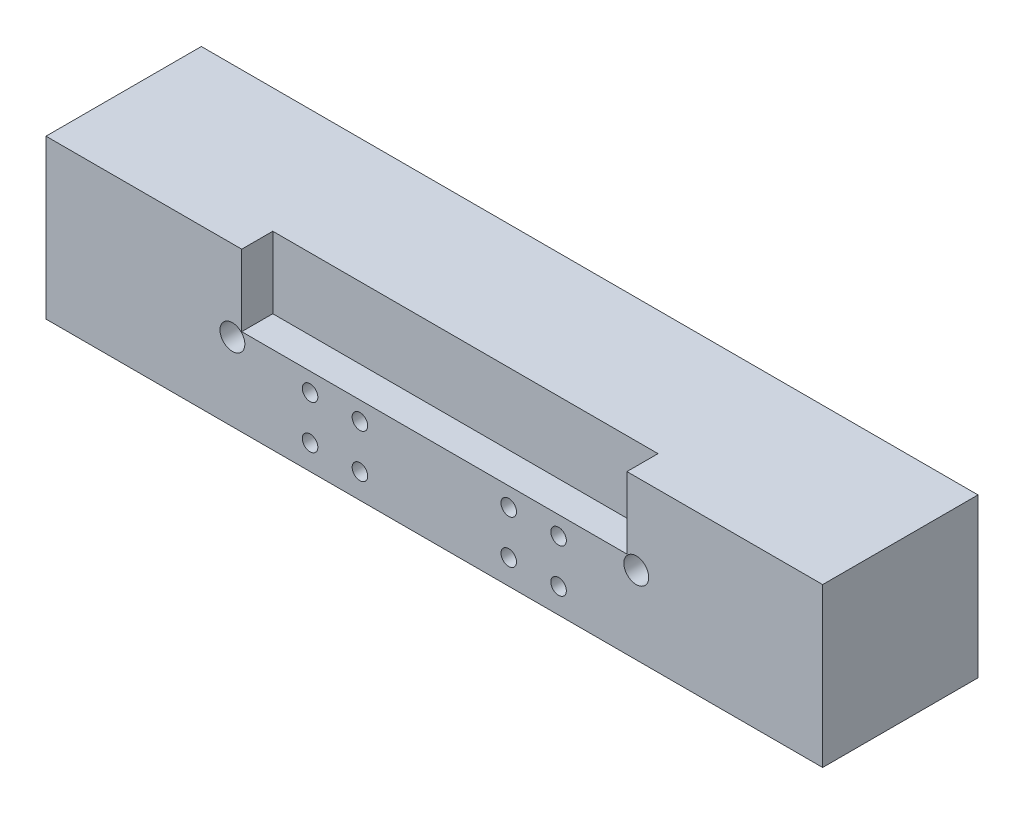
ISO-10303-21;
HEADER;
FILE_DESCRIPTION(('STEP AP214'),'2;1');
FILE_NAME('part.step','',(''),(''),'','','');
FILE_SCHEMA(('AUTOMOTIVE_DESIGN { 1 0 10303 214 1 1 1 1 }'));
ENDSEC;
DATA;
#1=APPLICATION_CONTEXT('core data for automotive mechanical design processes');
#2=APPLICATION_PROTOCOL_DEFINITION('international standard','automotive_design',2000,#1);
#3=PRODUCT_CONTEXT('',#1,'mechanical');
#4=PRODUCT('Part','Part','',(#3));
#5=PRODUCT_RELATED_PRODUCT_CATEGORY('part','',(#4));
#6=PRODUCT_DEFINITION_FORMATION('','',#4);
#7=PRODUCT_DEFINITION_CONTEXT('part definition',#1,'design');
#8=PRODUCT_DEFINITION('design','',#6,#7);
#9=PRODUCT_DEFINITION_SHAPE('','',#8);
#10=(LENGTH_UNIT() NAMED_UNIT(*) SI_UNIT(.MILLI.,.METRE.));
#11=(NAMED_UNIT(*) PLANE_ANGLE_UNIT() SI_UNIT($,.RADIAN.));
#12=(NAMED_UNIT(*) SI_UNIT($,.STERADIAN.) SOLID_ANGLE_UNIT());
#13=UNCERTAINTY_MEASURE_WITH_UNIT(LENGTH_MEASURE(1.E-05),#10,'distance_accuracy_value','');
#14=(GEOMETRIC_REPRESENTATION_CONTEXT(3) GLOBAL_UNCERTAINTY_ASSIGNED_CONTEXT((#13)) GLOBAL_UNIT_ASSIGNED_CONTEXT((#10,
#11,#12)) REPRESENTATION_CONTEXT('',''));
#15=CARTESIAN_POINT('',(0.,0.,0.));
#16=DIRECTION('',(0.,0.,1.));
#17=DIRECTION('',(1.,0.,0.));
#18=AXIS2_PLACEMENT_3D('',#15,#16,#17);
#19=CARTESIAN_POINT('',(-125.,51.,-25.));
#20=DIRECTION('',(1.,0.,0.));
#21=DIRECTION('',(0.,0.,-1.));
#22=AXIS2_PLACEMENT_3D('',#19,#20,#21);
#23=PLANE('',#22);
#24=DIRECTION('',(0.,0.,1.));
#25=VECTOR('',#24,1.);
#26=CARTESIAN_POINT('',(-125.,0.,-25.));
#27=LINE('',#26,#25);
#28=CARTESIAN_POINT('',(-125.,0.,-25.));
#29=VERTEX_POINT('',#28);
#30=CARTESIAN_POINT('',(-125.,0.,25.));
#31=VERTEX_POINT('',#30);
#32=EDGE_CURVE('E177',#29,#31,#27,.T.);
#33=ORIENTED_EDGE('',*,*,#32,.T.);
#34=DIRECTION('',(0.,-1.,0.));
#35=VECTOR('',#34,1.);
#36=CARTESIAN_POINT('',(-125.,51.,25.));
#37=LINE('',#36,#35);
#38=CARTESIAN_POINT('',(-125.,51.,25.));
#39=VERTEX_POINT('',#38);
#40=EDGE_CURVE('E11',#39,#31,#37,.T.);
#41=ORIENTED_EDGE('',*,*,#40,.F.);
#42=DIRECTION('',(0.,0.,1.));
#43=VECTOR('',#42,1.);
#44=CARTESIAN_POINT('',(-125.,51.,-25.));
#45=LINE('',#44,#43);
#46=CARTESIAN_POINT('',(-125.,51.,-25.));
#47=VERTEX_POINT('',#46);
#48=EDGE_CURVE('E186',#47,#39,#45,.T.);
#49=ORIENTED_EDGE('',*,*,#48,.F.);
#50=DIRECTION('',(0.,-1.,0.));
#51=VECTOR('',#50,1.);
#52=CARTESIAN_POINT('',(-125.,51.,-25.));
#53=LINE('',#52,#51);
#54=EDGE_CURVE('E193',#47,#29,#53,.T.);
#55=ORIENTED_EDGE('',*,*,#54,.T.);
#56=EDGE_LOOP('',(#33,#41,#49,#55));
#57=FACE_BOUND('',#56,.T.);
#58=ADVANCED_FACE('F17',(#57),#23,.F.);
#59=CARTESIAN_POINT('',(125.,51.,25.));
#60=DIRECTION('',(0.,0.,-1.));
#61=DIRECTION('',(-1.,0.,0.));
#62=AXIS2_PLACEMENT_3D('',#59,#60,#61);
#63=PLANE('',#62);
#64=CARTESIAN_POINT('',(40.,22.,25.));
#65=DIRECTION('',(0.,0.,1.));
#66=DIRECTION('',(1.,0.,0.));
#67=AXIS2_PLACEMENT_3D('',#64,#65,#66);
#68=CIRCLE('',#67,2.5);
#69=CARTESIAN_POINT('',(42.5,22.,25.));
#70=VERTEX_POINT('',#69);
#71=EDGE_CURVE('E148',#70,#70,#68,.T.);
#72=ORIENTED_EDGE('',*,*,#71,.F.);
#73=EDGE_LOOP('',(#72));
#74=FACE_BOUND('',#73,.T.);
#75=CARTESIAN_POINT('',(23.9497474683049,22.,25.));
#76=DIRECTION('',(0.,0.,1.));
#77=DIRECTION('',(1.,0.,0.));
#78=AXIS2_PLACEMENT_3D('',#75,#76,#77);
#79=CIRCLE('',#78,2.5);
#80=CARTESIAN_POINT('',(26.4497474683049,22.,25.));
#81=VERTEX_POINT('',#80);
#82=EDGE_CURVE('E154',#81,#81,#79,.T.);
#83=ORIENTED_EDGE('',*,*,#82,.F.);
#84=EDGE_LOOP('',(#83));
#85=FACE_BOUND('',#84,.T.);
#86=CARTESIAN_POINT('',(23.9497474683049,8.,25.));
#87=DIRECTION('',(0.,0.,1.));
#88=DIRECTION('',(1.,0.,0.));
#89=AXIS2_PLACEMENT_3D('',#86,#87,#88);
#90=CIRCLE('',#89,2.5);
#91=CARTESIAN_POINT('',(26.4497474683049,8.,25.));
#92=VERTEX_POINT('',#91);
#93=EDGE_CURVE('E160',#92,#92,#90,.T.);
#94=ORIENTED_EDGE('',*,*,#93,.F.);
#95=EDGE_LOOP('',(#94));
#96=FACE_BOUND('',#95,.T.);
#97=CARTESIAN_POINT('',(-23.9497474683049,8.,25.));
#98=DIRECTION('',(0.,0.,1.));
#99=DIRECTION('',(-1.,0.,0.));
#100=AXIS2_PLACEMENT_3D('',#97,#98,#99);
#101=CIRCLE('',#100,2.5);
#102=CARTESIAN_POINT('',(-26.4497474683049,8.,25.));
#103=VERTEX_POINT('',#102);
#104=EDGE_CURVE('E129',#103,#103,#101,.T.);
#105=ORIENTED_EDGE('',*,*,#104,.F.);
#106=EDGE_LOOP('',(#105));
#107=FACE_BOUND('',#106,.T.);
#108=CARTESIAN_POINT('',(-23.9497474683049,22.,25.));
#109=DIRECTION('',(0.,0.,1.));
#110=DIRECTION('',(-1.,0.,0.));
#111=AXIS2_PLACEMENT_3D('',#108,#109,#110);
#112=CIRCLE('',#111,2.5);
#113=CARTESIAN_POINT('',(-26.4497474683049,22.,25.));
#114=VERTEX_POINT('',#113);
#115=EDGE_CURVE('E130',#114,#114,#112,.T.);
#116=ORIENTED_EDGE('',*,*,#115,.F.);
#117=EDGE_LOOP('',(#116));
#118=FACE_BOUND('',#117,.T.);
#119=CARTESIAN_POINT('',(-40.,22.,25.));
#120=DIRECTION('',(0.,0.,1.));
#121=DIRECTION('',(-1.,0.,0.));
#122=AXIS2_PLACEMENT_3D('',#119,#120,#121);
#123=CIRCLE('',#122,2.5);
#124=CARTESIAN_POINT('',(-42.5,22.,25.));
#125=VERTEX_POINT('',#124);
#126=EDGE_CURVE('E136',#125,#125,#123,.T.);
#127=ORIENTED_EDGE('',*,*,#126,.F.);
#128=EDGE_LOOP('',(#127));
#129=FACE_BOUND('',#128,.T.);
#130=CARTESIAN_POINT('',(-40.,8.,25.));
#131=DIRECTION('',(0.,0.,1.));
#132=DIRECTION('',(-1.,0.,0.));
#133=AXIS2_PLACEMENT_3D('',#130,#131,#132);
#134=CIRCLE('',#133,2.5);
#135=CARTESIAN_POINT('',(-42.5,8.,25.));
#136=VERTEX_POINT('',#135);
#137=EDGE_CURVE('E121',#136,#136,#134,.T.);
#138=ORIENTED_EDGE('',*,*,#137,.F.);
#139=EDGE_LOOP('',(#138));
#140=FACE_BOUND('',#139,.T.);
#141=CARTESIAN_POINT('',(40.,8.,25.));
#142=DIRECTION('',(0.,0.,1.));
#143=DIRECTION('',(1.,0.,0.));
#144=AXIS2_PLACEMENT_3D('',#141,#142,#143);
#145=CIRCLE('',#144,2.5);
#146=CARTESIAN_POINT('',(42.5,8.,25.));
#147=VERTEX_POINT('',#146);
#148=EDGE_CURVE('E147',#147,#147,#145,.T.);
#149=ORIENTED_EDGE('',*,*,#148,.F.);
#150=EDGE_LOOP('',(#149));
#151=FACE_BOUND('',#150,.T.);
#152=CARTESIAN_POINT('',(-65.,25.,25.));
#153=DIRECTION('',(0.,0.,1.));
#154=DIRECTION('',(1.,0.,0.));
#155=AXIS2_PLACEMENT_3D('',#152,#153,#154);
#156=CIRCLE('',#155,4.);
#157=CARTESIAN_POINT('',(-61.,25.,25.));
#158=VERTEX_POINT('',#157);
#159=EDGE_CURVE('E178',#158,#158,#156,.T.);
#160=ORIENTED_EDGE('',*,*,#159,.F.);
#161=EDGE_LOOP('',(#160));
#162=FACE_BOUND('',#161,.T.);
#163=CARTESIAN_POINT('',(65.,25.,25.));
#164=DIRECTION('',(0.,0.,1.));
#165=DIRECTION('',(1.,0.,0.));
#166=AXIS2_PLACEMENT_3D('',#163,#164,#165);
#167=CIRCLE('',#166,4.);
#168=CARTESIAN_POINT('',(69.,25.,25.));
#169=VERTEX_POINT('',#168);
#170=EDGE_CURVE('E171',#169,#169,#167,.T.);
#171=ORIENTED_EDGE('',*,*,#170,.F.);
#172=EDGE_LOOP('',(#171));
#173=FACE_BOUND('',#172,.T.);
#174=DIRECTION('',(1.,0.,0.));
#175=VECTOR('',#174,1.);
#176=CARTESIAN_POINT('',(-62.,28.,25.));
#177=LINE('',#176,#175);
#178=CARTESIAN_POINT('',(-62.,28.,25.));
#179=VERTEX_POINT('',#178);
#180=CARTESIAN_POINT('',(62.,28.,25.));
#181=VERTEX_POINT('',#180);
#182=EDGE_CURVE('E112',#179,#181,#177,.T.);
#183=ORIENTED_EDGE('',*,*,#182,.F.);
#184=DIRECTION('',(0.,-1.,0.));
#185=VECTOR('',#184,1.);
#186=CARTESIAN_POINT('',(-62.,51.,25.));
#187=LINE('',#186,#185);
#188=CARTESIAN_POINT('',(-62.,51.,25.));
#189=VERTEX_POINT('',#188);
#190=EDGE_CURVE('E97',#189,#179,#187,.T.);
#191=ORIENTED_EDGE('',*,*,#190,.F.);
#192=DIRECTION('',(1.,0.,0.));
#193=VECTOR('',#192,1.);
#194=CARTESIAN_POINT('',(125.,51.,25.));
#195=LINE('',#194,#193);
#196=EDGE_CURVE('E68',#39,#189,#195,.T.);
#197=ORIENTED_EDGE('',*,*,#196,.F.);
#198=ORIENTED_EDGE('',*,*,#40,.T.);
#199=DIRECTION('',(1.,0.,0.));
#200=VECTOR('',#199,1.);
#201=CARTESIAN_POINT('',(125.,0.,25.));
#202=LINE('',#201,#200);
#203=CARTESIAN_POINT('',(125.,0.,25.));
#204=VERTEX_POINT('',#203);
#205=EDGE_CURVE('E196',#31,#204,#202,.T.);
#206=ORIENTED_EDGE('',*,*,#205,.T.);
#207=DIRECTION('',(0.,-1.,0.));
#208=VECTOR('',#207,1.);
#209=CARTESIAN_POINT('',(125.,51.,25.));
#210=LINE('',#209,#208);
#211=CARTESIAN_POINT('',(125.,51.,25.));
#212=VERTEX_POINT('',#211);
#213=EDGE_CURVE('E24',#212,#204,#210,.T.);
#214=ORIENTED_EDGE('',*,*,#213,.F.);
#215=CARTESIAN_POINT('',(62.,51.,25.));
#216=VERTEX_POINT('',#215);
#217=EDGE_CURVE('E188',#216,#212,#195,.T.);
#218=ORIENTED_EDGE('',*,*,#217,.F.);
#219=DIRECTION('',(0.,1.,0.));
#220=VECTOR('',#219,1.);
#221=CARTESIAN_POINT('',(62.,51.,25.));
#222=LINE('',#221,#220);
#223=EDGE_CURVE('E110',#181,#216,#222,.T.);
#224=ORIENTED_EDGE('',*,*,#223,.F.);
#225=EDGE_LOOP('',(#183,#191,#197,#198,#206,#214,#218,#224));
#226=FACE_BOUND('',#225,.T.);
#227=ADVANCED_FACE('F229',(#74,#85,#96,#107,#118,#129,#140,#151,#162,#173,#226),#63,.F.);
#228=CARTESIAN_POINT('',(125.,51.,-25.));
#229=DIRECTION('',(-1.,0.,0.));
#230=DIRECTION('',(0.,0.,1.));
#231=AXIS2_PLACEMENT_3D('',#228,#229,#230);
#232=PLANE('',#231);
#233=DIRECTION('',(0.,0.,-1.));
#234=VECTOR('',#233,1.);
#235=CARTESIAN_POINT('',(125.,0.,-25.));
#236=LINE('',#235,#234);
#237=CARTESIAN_POINT('',(125.,0.,-25.));
#238=VERTEX_POINT('',#237);
#239=EDGE_CURVE('E198',#204,#238,#236,.T.);
#240=ORIENTED_EDGE('',*,*,#239,.T.);
#241=DIRECTION('',(0.,-1.,0.));
#242=VECTOR('',#241,1.);
#243=CARTESIAN_POINT('',(125.,51.,-25.));
#244=LINE('',#243,#242);
#245=CARTESIAN_POINT('',(125.,51.,-25.));
#246=VERTEX_POINT('',#245);
#247=EDGE_CURVE('E202',#246,#238,#244,.T.);
#248=ORIENTED_EDGE('',*,*,#247,.F.);
#249=DIRECTION('',(0.,0.,-1.));
#250=VECTOR('',#249,1.);
#251=CARTESIAN_POINT('',(125.,51.,-25.));
#252=LINE('',#251,#250);
#253=EDGE_CURVE('E190',#212,#246,#252,.T.);
#254=ORIENTED_EDGE('',*,*,#253,.F.);
#255=ORIENTED_EDGE('',*,*,#213,.T.);
#256=EDGE_LOOP('',(#240,#248,#254,#255));
#257=FACE_BOUND('',#256,.T.);
#258=ADVANCED_FACE('F208',(#257),#232,.F.);
#259=CARTESIAN_POINT('',(125.,51.,-25.));
#260=DIRECTION('',(0.,0.,1.));
#261=DIRECTION('',(1.,0.,0.));
#262=AXIS2_PLACEMENT_3D('',#259,#260,#261);
#263=PLANE('',#262);
#264=CARTESIAN_POINT('',(-65.,25.,-25.));
#265=DIRECTION('',(0.,0.,1.));
#266=DIRECTION('',(1.,0.,0.));
#267=AXIS2_PLACEMENT_3D('',#264,#265,#266);
#268=CIRCLE('',#267,4.);
#269=CARTESIAN_POINT('',(-61.,25.,-25.));
#270=VERTEX_POINT('',#269);
#271=EDGE_CURVE('E174',#270,#270,#268,.T.);
#272=ORIENTED_EDGE('',*,*,#271,.T.);
#273=EDGE_LOOP('',(#272));
#274=FACE_BOUND('',#273,.T.);
#275=CARTESIAN_POINT('',(65.,25.,-25.));
#276=DIRECTION('',(0.,0.,1.));
#277=DIRECTION('',(1.,0.,0.));
#278=AXIS2_PLACEMENT_3D('',#275,#276,#277);
#279=CIRCLE('',#278,4.);
#280=CARTESIAN_POINT('',(69.,25.,-25.));
#281=VERTEX_POINT('',#280);
#282=EDGE_CURVE('E181',#281,#281,#279,.T.);
#283=ORIENTED_EDGE('',*,*,#282,.T.);
#284=EDGE_LOOP('',(#283));
#285=FACE_BOUND('',#284,.T.);
#286=DIRECTION('',(-1.,0.,0.));
#287=VECTOR('',#286,1.);
#288=CARTESIAN_POINT('',(125.,0.,-25.));
#289=LINE('',#288,#287);
#290=EDGE_CURVE('E61',#238,#29,#289,.T.);
#291=ORIENTED_EDGE('',*,*,#290,.T.);
#292=ORIENTED_EDGE('',*,*,#54,.F.);
#293=DIRECTION('',(-1.,0.,0.));
#294=VECTOR('',#293,1.);
#295=CARTESIAN_POINT('',(125.,51.,-25.));
#296=LINE('',#295,#294);
#297=EDGE_CURVE('E40',#246,#47,#296,.T.);
#298=ORIENTED_EDGE('',*,*,#297,.F.);
#299=ORIENTED_EDGE('',*,*,#247,.T.);
#300=EDGE_LOOP('',(#291,#292,#298,#299));
#301=FACE_BOUND('',#300,.T.);
#302=ADVANCED_FACE('F217',(#274,#285,#301),#263,.F.);
#303=CARTESIAN_POINT('',(0.,51.,0.));
#304=DIRECTION('',(0.,-1.,0.));
#305=DIRECTION('',(0.,0.,-1.));
#306=AXIS2_PLACEMENT_3D('',#303,#304,#305);
#307=PLANE('',#306);
#308=ORIENTED_EDGE('',*,*,#196,.T.);
#309=DIRECTION('',(0.,0.,1.));
#310=VECTOR('',#309,1.);
#311=CARTESIAN_POINT('',(-62.,51.,15.));
#312=LINE('',#311,#310);
#313=CARTESIAN_POINT('',(-62.,51.,15.));
#314=VERTEX_POINT('',#313);
#315=EDGE_CURVE('E119',#314,#189,#312,.T.);
#316=ORIENTED_EDGE('',*,*,#315,.F.);
#317=DIRECTION('',(-1.,0.,0.));
#318=VECTOR('',#317,1.);
#319=CARTESIAN_POINT('',(-62.,51.,15.));
#320=LINE('',#319,#318);
#321=CARTESIAN_POINT('',(62.,51.,15.));
#322=VERTEX_POINT('',#321);
#323=EDGE_CURVE('E102',#322,#314,#320,.T.);
#324=ORIENTED_EDGE('',*,*,#323,.F.);
#325=DIRECTION('',(0.,0.,1.));
#326=VECTOR('',#325,1.);
#327=CARTESIAN_POINT('',(62.,51.,15.));
#328=LINE('',#327,#326);
#329=EDGE_CURVE('E122',#322,#216,#328,.T.);
#330=ORIENTED_EDGE('',*,*,#329,.T.);
#331=ORIENTED_EDGE('',*,*,#217,.T.);
#332=ORIENTED_EDGE('',*,*,#253,.T.);
#333=ORIENTED_EDGE('',*,*,#297,.T.);
#334=ORIENTED_EDGE('',*,*,#48,.T.);
#335=EDGE_LOOP('',(#308,#316,#324,#330,#331,#332,#333,#334));
#336=FACE_BOUND('',#335,.T.);
#337=ADVANCED_FACE('F219',(#336),#307,.F.);
#338=CARTESIAN_POINT('',(0.,0.,0.));
#339=DIRECTION('',(0.,-1.,0.));
#340=DIRECTION('',(0.,0.,-1.));
#341=AXIS2_PLACEMENT_3D('',#338,#339,#340);
#342=PLANE('',#341);
#343=ORIENTED_EDGE('',*,*,#32,.F.);
#344=ORIENTED_EDGE('',*,*,#290,.F.);
#345=ORIENTED_EDGE('',*,*,#239,.F.);
#346=ORIENTED_EDGE('',*,*,#205,.F.);
#347=EDGE_LOOP('',(#343,#344,#345,#346));
#348=FACE_BOUND('',#347,.T.);
#349=ADVANCED_FACE('F213',(#348),#342,.T.);
#350=CARTESIAN_POINT('',(65.,25.,-25.));
#351=DIRECTION('',(0.,0.,1.));
#352=DIRECTION('',(1.,0.,0.));
#353=AXIS2_PLACEMENT_3D('',#350,#351,#352);
#354=CYLINDRICAL_SURFACE('',#353,4.);
#355=ORIENTED_EDGE('',*,*,#282,.F.);
#356=EDGE_LOOP('',(#355));
#357=FACE_BOUND('',#356,.T.);
#358=ORIENTED_EDGE('',*,*,#170,.T.);
#359=EDGE_LOOP('',(#358));
#360=FACE_BOUND('',#359,.T.);
#361=ADVANCED_FACE('F342',(#357,#360),#354,.F.);
#362=CARTESIAN_POINT('',(-65.,25.,-25.));
#363=DIRECTION('',(0.,0.,1.));
#364=DIRECTION('',(1.,0.,0.));
#365=AXIS2_PLACEMENT_3D('',#362,#363,#364);
#366=CYLINDRICAL_SURFACE('',#365,4.);
#367=ORIENTED_EDGE('',*,*,#271,.F.);
#368=EDGE_LOOP('',(#367));
#369=FACE_BOUND('',#368,.T.);
#370=ORIENTED_EDGE('',*,*,#159,.T.);
#371=EDGE_LOOP('',(#370));
#372=FACE_BOUND('',#371,.T.);
#373=ADVANCED_FACE('F338',(#369,#372),#366,.F.);
#374=CARTESIAN_POINT('',(40.,8.,15.));
#375=DIRECTION('',(0.,0.,1.));
#376=DIRECTION('',(1.,0.,0.));
#377=AXIS2_PLACEMENT_3D('',#374,#375,#376);
#378=CYLINDRICAL_SURFACE('',#377,2.5);
#379=CARTESIAN_POINT('',(40.,8.,15.));
#380=DIRECTION('',(0.,0.,1.));
#381=DIRECTION('',(1.,0.,0.));
#382=AXIS2_PLACEMENT_3D('',#379,#380,#381);
#383=CIRCLE('',#382,2.5);
#384=CARTESIAN_POINT('',(42.5,8.,15.));
#385=VERTEX_POINT('',#384);
#386=EDGE_CURVE('E168',#385,#385,#383,.T.);
#387=ORIENTED_EDGE('',*,*,#386,.F.);
#388=EDGE_LOOP('',(#387));
#389=FACE_BOUND('',#388,.T.);
#390=ORIENTED_EDGE('',*,*,#148,.T.);
#391=EDGE_LOOP('',(#390));
#392=FACE_BOUND('',#391,.T.);
#393=ADVANCED_FACE('F334',(#389,#392),#378,.F.);
#394=CARTESIAN_POINT('',(40.,8.,15.));
#395=DIRECTION('',(0.,0.,1.));
#396=DIRECTION('',(1.,0.,0.));
#397=AXIS2_PLACEMENT_3D('',#394,#395,#396);
#398=PLANE('',#397);
#399=ORIENTED_EDGE('',*,*,#386,.T.);
#400=EDGE_LOOP('',(#399));
#401=FACE_BOUND('',#400,.T.);
#402=ADVANCED_FACE('F300',(#401),#398,.T.);
#403=CARTESIAN_POINT('',(-40.,8.,15.));
#404=DIRECTION('',(0.,0.,1.));
#405=DIRECTION('',(1.,0.,0.));
#406=AXIS2_PLACEMENT_3D('',#403,#404,#405);
#407=CYLINDRICAL_SURFACE('',#406,2.5);
#408=CARTESIAN_POINT('',(-40.,8.,15.));
#409=DIRECTION('',(0.,0.,1.));
#410=DIRECTION('',(-1.,0.,0.));
#411=AXIS2_PLACEMENT_3D('',#408,#409,#410);
#412=CIRCLE('',#411,2.5);
#413=CARTESIAN_POINT('',(-42.5,8.,15.));
#414=VERTEX_POINT('',#413);
#415=EDGE_CURVE('E139',#414,#414,#412,.T.);
#416=ORIENTED_EDGE('',*,*,#415,.F.);
#417=EDGE_LOOP('',(#416));
#418=FACE_BOUND('',#417,.T.);
#419=ORIENTED_EDGE('',*,*,#137,.T.);
#420=EDGE_LOOP('',(#419));
#421=FACE_BOUND('',#420,.T.);
#422=ADVANCED_FACE('F296',(#418,#421),#407,.F.);
#423=CARTESIAN_POINT('',(-40.,8.,15.));
#424=DIRECTION('',(0.,0.,-1.));
#425=DIRECTION('',(-1.,0.,0.));
#426=AXIS2_PLACEMENT_3D('',#423,#424,#425);
#427=PLANE('',#426);
#428=ORIENTED_EDGE('',*,*,#415,.T.);
#429=EDGE_LOOP('',(#428));
#430=FACE_BOUND('',#429,.T.);
#431=ADVANCED_FACE('F292',(#430),#427,.F.);
#432=CARTESIAN_POINT('',(-40.,22.,15.));
#433=DIRECTION('',(0.,0.,1.));
#434=DIRECTION('',(1.,0.,0.));
#435=AXIS2_PLACEMENT_3D('',#432,#433,#434);
#436=CYLINDRICAL_SURFACE('',#435,2.5);
#437=CARTESIAN_POINT('',(-40.,22.,15.));
#438=DIRECTION('',(0.,0.,1.));
#439=DIRECTION('',(-1.,0.,0.));
#440=AXIS2_PLACEMENT_3D('',#437,#438,#439);
#441=CIRCLE('',#440,2.5);
#442=CARTESIAN_POINT('',(-42.5,22.,15.));
#443=VERTEX_POINT('',#442);
#444=EDGE_CURVE('E133',#443,#443,#441,.T.);
#445=ORIENTED_EDGE('',*,*,#444,.F.);
#446=EDGE_LOOP('',(#445));
#447=FACE_BOUND('',#446,.T.);
#448=ORIENTED_EDGE('',*,*,#126,.T.);
#449=EDGE_LOOP('',(#448));
#450=FACE_BOUND('',#449,.T.);
#451=ADVANCED_FACE('F288',(#447,#450),#436,.F.);
#452=CARTESIAN_POINT('',(-40.,22.,15.));
#453=DIRECTION('',(0.,0.,-1.));
#454=DIRECTION('',(-1.,0.,0.));
#455=AXIS2_PLACEMENT_3D('',#452,#453,#454);
#456=PLANE('',#455);
#457=ORIENTED_EDGE('',*,*,#444,.T.);
#458=EDGE_LOOP('',(#457));
#459=FACE_BOUND('',#458,.T.);
#460=ADVANCED_FACE('F284',(#459),#456,.F.);
#461=CARTESIAN_POINT('',(-23.9497474683049,22.,15.));
#462=DIRECTION('',(0.,0.,1.));
#463=DIRECTION('',(1.,0.,0.));
#464=AXIS2_PLACEMENT_3D('',#461,#462,#463);
#465=CYLINDRICAL_SURFACE('',#464,2.5);
#466=CARTESIAN_POINT('',(-23.9497474683049,22.,15.));
#467=DIRECTION('',(0.,0.,1.));
#468=DIRECTION('',(-1.,0.,0.));
#469=AXIS2_PLACEMENT_3D('',#466,#467,#468);
#470=CIRCLE('',#469,2.5);
#471=CARTESIAN_POINT('',(-26.4497474683049,22.,15.));
#472=VERTEX_POINT('',#471);
#473=EDGE_CURVE('E126',#472,#472,#470,.T.);
#474=ORIENTED_EDGE('',*,*,#473,.F.);
#475=EDGE_LOOP('',(#474));
#476=FACE_BOUND('',#475,.T.);
#477=ORIENTED_EDGE('',*,*,#115,.T.);
#478=EDGE_LOOP('',(#477));
#479=FACE_BOUND('',#478,.T.);
#480=ADVANCED_FACE('F280',(#476,#479),#465,.F.);
#481=CARTESIAN_POINT('',(-23.9497474683049,22.,15.));
#482=DIRECTION('',(0.,0.,-1.));
#483=DIRECTION('',(-1.,0.,0.));
#484=AXIS2_PLACEMENT_3D('',#481,#482,#483);
#485=PLANE('',#484);
#486=ORIENTED_EDGE('',*,*,#473,.T.);
#487=EDGE_LOOP('',(#486));
#488=FACE_BOUND('',#487,.T.);
#489=ADVANCED_FACE('F276',(#488),#485,.F.);
#490=CARTESIAN_POINT('',(-23.9497474683049,8.,15.));
#491=DIRECTION('',(0.,0.,1.));
#492=DIRECTION('',(1.,0.,0.));
#493=AXIS2_PLACEMENT_3D('',#490,#491,#492);
#494=CYLINDRICAL_SURFACE('',#493,2.5);
#495=CARTESIAN_POINT('',(-23.9497474683049,8.,15.));
#496=DIRECTION('',(0.,0.,1.));
#497=DIRECTION('',(-1.,0.,0.));
#498=AXIS2_PLACEMENT_3D('',#495,#496,#497);
#499=CIRCLE('',#498,2.5);
#500=CARTESIAN_POINT('',(-26.4497474683049,8.,15.));
#501=VERTEX_POINT('',#500);
#502=EDGE_CURVE('E163',#501,#501,#499,.T.);
#503=ORIENTED_EDGE('',*,*,#502,.F.);
#504=EDGE_LOOP('',(#503));
#505=FACE_BOUND('',#504,.T.);
#506=ORIENTED_EDGE('',*,*,#104,.T.);
#507=EDGE_LOOP('',(#506));
#508=FACE_BOUND('',#507,.T.);
#509=ADVANCED_FACE('F279',(#505,#508),#494,.F.);
#510=CARTESIAN_POINT('',(-23.9497474683049,8.,15.));
#511=DIRECTION('',(0.,0.,-1.));
#512=DIRECTION('',(-1.,0.,0.));
#513=AXIS2_PLACEMENT_3D('',#510,#511,#512);
#514=PLANE('',#513);
#515=ORIENTED_EDGE('',*,*,#502,.T.);
#516=EDGE_LOOP('',(#515));
#517=FACE_BOUND('',#516,.T.);
#518=ADVANCED_FACE('F324',(#517),#514,.F.);
#519=CARTESIAN_POINT('',(23.9497474683049,8.,15.));
#520=DIRECTION('',(0.,0.,1.));
#521=DIRECTION('',(1.,0.,0.));
#522=AXIS2_PLACEMENT_3D('',#519,#520,#521);
#523=CYLINDRICAL_SURFACE('',#522,2.5);
#524=CARTESIAN_POINT('',(23.9497474683049,8.,15.));
#525=DIRECTION('',(0.,0.,1.));
#526=DIRECTION('',(1.,0.,0.));
#527=AXIS2_PLACEMENT_3D('',#524,#525,#526);
#528=CIRCLE('',#527,2.5);
#529=CARTESIAN_POINT('',(26.4497474683049,8.,15.));
#530=VERTEX_POINT('',#529);
#531=EDGE_CURVE('E157',#530,#530,#528,.T.);
#532=ORIENTED_EDGE('',*,*,#531,.F.);
#533=EDGE_LOOP('',(#532));
#534=FACE_BOUND('',#533,.T.);
#535=ORIENTED_EDGE('',*,*,#93,.T.);
#536=EDGE_LOOP('',(#535));
#537=FACE_BOUND('',#536,.T.);
#538=ADVANCED_FACE('F320',(#534,#537),#523,.F.);
#539=CARTESIAN_POINT('',(23.9497474683049,8.,15.));
#540=DIRECTION('',(0.,0.,1.));
#541=DIRECTION('',(1.,0.,0.));
#542=AXIS2_PLACEMENT_3D('',#539,#540,#541);
#543=PLANE('',#542);
#544=ORIENTED_EDGE('',*,*,#531,.T.);
#545=EDGE_LOOP('',(#544));
#546=FACE_BOUND('',#545,.T.);
#547=ADVANCED_FACE('F316',(#546),#543,.T.);
#548=CARTESIAN_POINT('',(23.9497474683049,22.,15.));
#549=DIRECTION('',(0.,0.,1.));
#550=DIRECTION('',(1.,0.,0.));
#551=AXIS2_PLACEMENT_3D('',#548,#549,#550);
#552=CYLINDRICAL_SURFACE('',#551,2.5);
#553=CARTESIAN_POINT('',(23.9497474683049,22.,15.));
#554=DIRECTION('',(0.,0.,1.));
#555=DIRECTION('',(1.,0.,0.));
#556=AXIS2_PLACEMENT_3D('',#553,#554,#555);
#557=CIRCLE('',#556,2.5);
#558=CARTESIAN_POINT('',(26.4497474683049,22.,15.));
#559=VERTEX_POINT('',#558);
#560=EDGE_CURVE('E151',#559,#559,#557,.T.);
#561=ORIENTED_EDGE('',*,*,#560,.F.);
#562=EDGE_LOOP('',(#561));
#563=FACE_BOUND('',#562,.T.);
#564=ORIENTED_EDGE('',*,*,#82,.T.);
#565=EDGE_LOOP('',(#564));
#566=FACE_BOUND('',#565,.T.);
#567=ADVANCED_FACE('F312',(#563,#566),#552,.F.);
#568=CARTESIAN_POINT('',(23.9497474683049,22.,15.));
#569=DIRECTION('',(0.,0.,1.));
#570=DIRECTION('',(1.,0.,0.));
#571=AXIS2_PLACEMENT_3D('',#568,#569,#570);
#572=PLANE('',#571);
#573=ORIENTED_EDGE('',*,*,#560,.T.);
#574=EDGE_LOOP('',(#573));
#575=FACE_BOUND('',#574,.T.);
#576=ADVANCED_FACE('F308',(#575),#572,.T.);
#577=CARTESIAN_POINT('',(40.,22.,15.));
#578=DIRECTION('',(0.,0.,1.));
#579=DIRECTION('',(1.,0.,0.));
#580=AXIS2_PLACEMENT_3D('',#577,#578,#579);
#581=CYLINDRICAL_SURFACE('',#580,2.5);
#582=CARTESIAN_POINT('',(40.,22.,15.));
#583=DIRECTION('',(0.,0.,1.));
#584=DIRECTION('',(1.,0.,0.));
#585=AXIS2_PLACEMENT_3D('',#582,#583,#584);
#586=CIRCLE('',#585,2.5);
#587=CARTESIAN_POINT('',(42.5,22.,15.));
#588=VERTEX_POINT('',#587);
#589=EDGE_CURVE('E144',#588,#588,#586,.T.);
#590=ORIENTED_EDGE('',*,*,#589,.F.);
#591=EDGE_LOOP('',(#590));
#592=FACE_BOUND('',#591,.T.);
#593=ORIENTED_EDGE('',*,*,#71,.T.);
#594=EDGE_LOOP('',(#593));
#595=FACE_BOUND('',#594,.T.);
#596=ADVANCED_FACE('F304',(#592,#595),#581,.F.);
#597=CARTESIAN_POINT('',(40.,22.,15.));
#598=DIRECTION('',(0.,0.,1.));
#599=DIRECTION('',(1.,0.,0.));
#600=AXIS2_PLACEMENT_3D('',#597,#598,#599);
#601=PLANE('',#600);
#602=ORIENTED_EDGE('',*,*,#589,.T.);
#603=EDGE_LOOP('',(#602));
#604=FACE_BOUND('',#603,.T.);
#605=ADVANCED_FACE('F272',(#604),#601,.T.);
#606=CARTESIAN_POINT('',(-62.,51.,15.));
#607=DIRECTION('',(-1.,0.,0.));
#608=DIRECTION('',(0.,0.,1.));
#609=AXIS2_PLACEMENT_3D('',#606,#607,#608);
#610=PLANE('',#609);
#611=ORIENTED_EDGE('',*,*,#190,.T.);
#612=DIRECTION('',(0.,0.,1.));
#613=VECTOR('',#612,1.);
#614=CARTESIAN_POINT('',(-62.,28.,15.));
#615=LINE('',#614,#613);
#616=CARTESIAN_POINT('',(-62.,28.,15.));
#617=VERTEX_POINT('',#616);
#618=EDGE_CURVE('E92',#617,#179,#615,.T.);
#619=ORIENTED_EDGE('',*,*,#618,.F.);
#620=DIRECTION('',(0.,-1.,0.));
#621=VECTOR('',#620,1.);
#622=CARTESIAN_POINT('',(-62.,51.,15.));
#623=LINE('',#622,#621);
#624=EDGE_CURVE('E96',#314,#617,#623,.T.);
#625=ORIENTED_EDGE('',*,*,#624,.F.);
#626=ORIENTED_EDGE('',*,*,#315,.T.);
#627=EDGE_LOOP('',(#611,#619,#625,#626));
#628=FACE_BOUND('',#627,.T.);
#629=ADVANCED_FACE('F94',(#628),#610,.F.);
#630=CARTESIAN_POINT('',(62.,51.,15.));
#631=DIRECTION('',(1.,0.,0.));
#632=DIRECTION('',(0.,0.,-1.));
#633=AXIS2_PLACEMENT_3D('',#630,#631,#632);
#634=PLANE('',#633);
#635=ORIENTED_EDGE('',*,*,#223,.T.);
#636=ORIENTED_EDGE('',*,*,#329,.F.);
#637=DIRECTION('',(0.,1.,0.));
#638=VECTOR('',#637,1.);
#639=CARTESIAN_POINT('',(62.,51.,15.));
#640=LINE('',#639,#638);
#641=CARTESIAN_POINT('',(62.,28.,15.));
#642=VERTEX_POINT('',#641);
#643=EDGE_CURVE('E31',#642,#322,#640,.T.);
#644=ORIENTED_EDGE('',*,*,#643,.F.);
#645=DIRECTION('',(0.,0.,1.));
#646=VECTOR('',#645,1.);
#647=CARTESIAN_POINT('',(62.,28.,15.));
#648=LINE('',#647,#646);
#649=EDGE_CURVE('E101',#642,#181,#648,.T.);
#650=ORIENTED_EDGE('',*,*,#649,.T.);
#651=EDGE_LOOP('',(#635,#636,#644,#650));
#652=FACE_BOUND('',#651,.T.);
#653=ADVANCED_FACE('F263',(#652),#634,.F.);
#654=CARTESIAN_POINT('',(-62.,28.,15.));
#655=DIRECTION('',(0.,-1.,0.));
#656=DIRECTION('',(0.,0.,-1.));
#657=AXIS2_PLACEMENT_3D('',#654,#655,#656);
#658=PLANE('',#657);
#659=ORIENTED_EDGE('',*,*,#182,.T.);
#660=ORIENTED_EDGE('',*,*,#649,.F.);
#661=DIRECTION('',(1.,0.,0.));
#662=VECTOR('',#661,1.);
#663=CARTESIAN_POINT('',(-62.,28.,15.));
#664=LINE('',#663,#662);
#665=EDGE_CURVE('E104',#617,#642,#664,.T.);
#666=ORIENTED_EDGE('',*,*,#665,.F.);
#667=ORIENTED_EDGE('',*,*,#618,.T.);
#668=EDGE_LOOP('',(#659,#660,#666,#667));
#669=FACE_BOUND('',#668,.T.);
#670=ADVANCED_FACE('F105',(#669),#658,.F.);
#671=CARTESIAN_POINT('',(0.,0.,15.));
#672=DIRECTION('',(0.,0.,1.));
#673=DIRECTION('',(1.,0.,0.));
#674=AXIS2_PLACEMENT_3D('',#671,#672,#673);
#675=PLANE('',#674);
#676=ORIENTED_EDGE('',*,*,#624,.T.);
#677=ORIENTED_EDGE('',*,*,#665,.T.);
#678=ORIENTED_EDGE('',*,*,#643,.T.);
#679=ORIENTED_EDGE('',*,*,#323,.T.);
#680=EDGE_LOOP('',(#676,#677,#678,#679));
#681=FACE_BOUND('',#680,.T.);
#682=ADVANCED_FACE('F107',(#681),#675,.T.);
#683=CLOSED_SHELL('',(#58,#227,#258,#302,#337,#349,#361,#373,#393,#402,#422,#431,#451,#460,#480,
#489,#509,#518,#538,#547,#567,#576,#596,#605,#629,#653,#670,#682));
#684=MANIFOLD_SOLID_BREP('B1',#683);
#685=ADVANCED_BREP_SHAPE_REPRESENTATION('',(#18,#684),#14);
#686=SHAPE_DEFINITION_REPRESENTATION(#9,#685);
ENDSEC;
END-ISO-10303-21;
